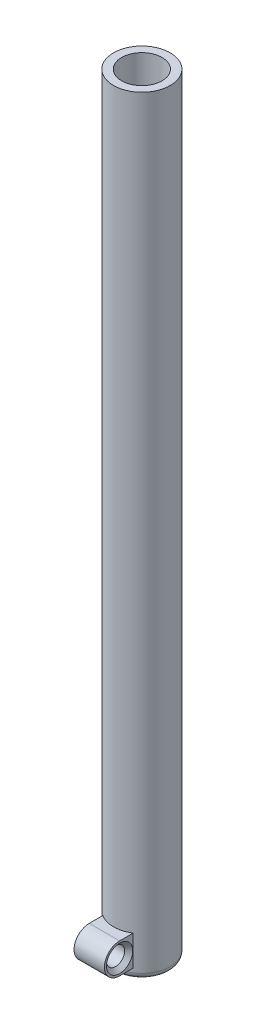
ISO-10303-21;
HEADER;
FILE_DESCRIPTION(('STEP AP214'),'2;1');
FILE_NAME('part.step','',(''),(''),'','','');
FILE_SCHEMA(('AUTOMOTIVE_DESIGN { 1 0 10303 214 1 1 1 1 }'));
ENDSEC;
DATA;
#1=APPLICATION_CONTEXT('core data for automotive mechanical design processes');
#2=APPLICATION_PROTOCOL_DEFINITION('international standard','automotive_design',2000,#1);
#3=PRODUCT_CONTEXT('',#1,'mechanical');
#4=PRODUCT('Part','Part','',(#3));
#5=PRODUCT_RELATED_PRODUCT_CATEGORY('part','',(#4));
#6=PRODUCT_DEFINITION_FORMATION('','',#4);
#7=PRODUCT_DEFINITION_CONTEXT('part definition',#1,'design');
#8=PRODUCT_DEFINITION('design','',#6,#7);
#9=PRODUCT_DEFINITION_SHAPE('','',#8);
#10=(LENGTH_UNIT() NAMED_UNIT(*) SI_UNIT(.MILLI.,.METRE.));
#11=(NAMED_UNIT(*) PLANE_ANGLE_UNIT() SI_UNIT($,.RADIAN.));
#12=(NAMED_UNIT(*) SI_UNIT($,.STERADIAN.) SOLID_ANGLE_UNIT());
#13=UNCERTAINTY_MEASURE_WITH_UNIT(LENGTH_MEASURE(1.E-05),#10,'distance_accuracy_value','');
#14=(GEOMETRIC_REPRESENTATION_CONTEXT(3) GLOBAL_UNCERTAINTY_ASSIGNED_CONTEXT((#13)) GLOBAL_UNIT_ASSIGNED_CONTEXT((#10,
#11,#12)) REPRESENTATION_CONTEXT('',''));
#15=CARTESIAN_POINT('',(0.,0.,0.));
#16=DIRECTION('',(0.,0.,1.));
#17=DIRECTION('',(1.,0.,0.));
#18=AXIS2_PLACEMENT_3D('',#15,#16,#17);
#19=CARTESIAN_POINT('',(-7.5,12.5,18.5));
#20=DIRECTION('',(-1.,0.,0.));
#21=DIRECTION('',(0.,0.,1.));
#22=AXIS2_PLACEMENT_3D('',#19,#20,#21);
#23=CYLINDRICAL_SURFACE('',#22,7.5);
#24=DIRECTION('',(1.,0.,0.));
#25=VECTOR('',#24,1.);
#26=CARTESIAN_POINT('',(-7.5,20.,18.5));
#27=LINE('',#26,#25);
#28=CARTESIAN_POINT('',(-7.5,20.,18.5));
#29=VERTEX_POINT('',#28);
#30=CARTESIAN_POINT('',(7.5,20.,18.5));
#31=VERTEX_POINT('',#30);
#32=EDGE_CURVE('E127',#29,#31,#27,.T.);
#33=ORIENTED_EDGE('',*,*,#32,.F.);
#34=CARTESIAN_POINT('',(-7.5,12.5,18.5));
#35=DIRECTION('',(1.,0.,0.));
#36=DIRECTION('',(0.,1.,0.));
#37=AXIS2_PLACEMENT_3D('',#34,#35,#36);
#38=CIRCLE('',#37,7.5);
#39=CARTESIAN_POINT('',(-7.5,5.,18.5));
#40=VERTEX_POINT('',#39);
#41=EDGE_CURVE('E68',#40,#29,#38,.F.);
#42=ORIENTED_EDGE('',*,*,#41,.F.);
#43=DIRECTION('',(1.,0.,0.));
#44=VECTOR('',#43,1.);
#45=CARTESIAN_POINT('',(-7.5,5.,18.5));
#46=LINE('',#45,#44);
#47=CARTESIAN_POINT('',(7.5,5.,18.5));
#48=VERTEX_POINT('',#47);
#49=EDGE_CURVE('E129',#48,#40,#46,.F.);
#50=ORIENTED_EDGE('',*,*,#49,.F.);
#51=CARTESIAN_POINT('',(7.5,12.5,18.5));
#52=DIRECTION('',(-1.,0.,0.));
#53=DIRECTION('',(0.,-1.,0.));
#54=AXIS2_PLACEMENT_3D('',#51,#52,#53);
#55=CIRCLE('',#54,7.5);
#56=EDGE_CURVE('E61',#31,#48,#55,.F.);
#57=ORIENTED_EDGE('',*,*,#56,.F.);
#58=EDGE_LOOP('',(#33,#42,#50,#57));
#59=FACE_BOUND('',#58,.T.);
#60=ADVANCED_FACE('F46',(#59),#23,.T.);
#61=CARTESIAN_POINT('',(0.,380.,0.));
#62=DIRECTION('',(0.,-1.,0.));
#63=DIRECTION('',(0.,0.,-1.));
#64=AXIS2_PLACEMENT_3D('',#61,#62,#63);
#65=CYLINDRICAL_SURFACE('',#64,14.);
#66=CARTESIAN_POINT('',(0.,3.,0.));
#67=DIRECTION('',(0.,1.,0.));
#68=DIRECTION('',(0.,0.,1.));
#69=AXIS2_PLACEMENT_3D('',#66,#67,#68);
#70=CIRCLE('',#69,14.);
#71=CARTESIAN_POINT('',(0.,3.,14.));
#72=VERTEX_POINT('',#71);
#73=EDGE_CURVE('E54',#72,#72,#70,.T.);
#74=ORIENTED_EDGE('',*,*,#73,.T.);
#75=EDGE_LOOP('',(#74));
#76=FACE_BOUND('',#75,.T.);
#77=CARTESIAN_POINT('',(0.,380.,0.));
#78=DIRECTION('',(0.,1.,0.));
#79=DIRECTION('',(0.,0.,1.));
#80=AXIS2_PLACEMENT_3D('',#77,#78,#79);
#81=CIRCLE('',#80,14.);
#82=CARTESIAN_POINT('',(0.,380.,14.));
#83=VERTEX_POINT('',#82);
#84=EDGE_CURVE('E122',#83,#83,#81,.T.);
#85=ORIENTED_EDGE('',*,*,#84,.F.);
#86=EDGE_LOOP('',(#85));
#87=FACE_BOUND('',#86,.T.);
#88=DIRECTION('',(0.,-1.,0.));
#89=VECTOR('',#88,1.);
#90=CARTESIAN_POINT('',(-7.49999999999996,380.,11.8215904175369));
#91=LINE('',#90,#89);
#92=CARTESIAN_POINT('',(-7.5,20.,11.8215904175369));
#93=VERTEX_POINT('',#92);
#94=CARTESIAN_POINT('',(-7.5,5.,11.8215904175369));
#95=VERTEX_POINT('',#94);
#96=EDGE_CURVE('E91',#93,#95,#91,.T.);
#97=ORIENTED_EDGE('',*,*,#96,.F.);
#98=CARTESIAN_POINT('',(0.,20.,0.));
#99=DIRECTION('',(0.,1.,0.));
#100=DIRECTION('',(0.,0.,1.));
#101=AXIS2_PLACEMENT_3D('',#98,#99,#100);
#102=CIRCLE('',#101,14.);
#103=CARTESIAN_POINT('',(7.5,20.,11.8215904175369));
#104=VERTEX_POINT('',#103);
#105=EDGE_CURVE('E102',#104,#93,#102,.F.);
#106=ORIENTED_EDGE('',*,*,#105,.F.);
#107=DIRECTION('',(0.,-1.,0.));
#108=VECTOR('',#107,1.);
#109=CARTESIAN_POINT('',(7.49999999999998,380.,11.8215904175369));
#110=LINE('',#109,#108);
#111=CARTESIAN_POINT('',(7.49999999999998,4.99999999999995,11.8215904175369));
#112=VERTEX_POINT('',#111);
#113=EDGE_CURVE('E109',#112,#104,#110,.F.);
#114=ORIENTED_EDGE('',*,*,#113,.F.);
#115=CARTESIAN_POINT('',(0.,5.,0.));
#116=DIRECTION('',(0.,-1.,0.));
#117=DIRECTION('',(0.,0.,-1.));
#118=AXIS2_PLACEMENT_3D('',#115,#116,#117);
#119=CIRCLE('',#118,14.);
#120=EDGE_CURVE('E105',#95,#112,#119,.F.);
#121=ORIENTED_EDGE('',*,*,#120,.F.);
#122=EDGE_LOOP('',(#97,#106,#114,#121));
#123=FACE_BOUND('',#122,.T.);
#124=ADVANCED_FACE('F100',(#76,#87,#123),#65,.T.);
#125=CARTESIAN_POINT('',(0.,380.,0.));
#126=DIRECTION('',(0.,1.,0.));
#127=DIRECTION('',(0.,0.,1.));
#128=AXIS2_PLACEMENT_3D('',#125,#126,#127);
#129=PLANE('',#128);
#130=ORIENTED_EDGE('',*,*,#84,.T.);
#131=EDGE_LOOP('',(#130));
#132=FACE_BOUND('',#131,.T.);
#133=CARTESIAN_POINT('',(0.,380.,0.));
#134=DIRECTION('',(0.,1.,0.));
#135=DIRECTION('',(0.,0.,1.));
#136=AXIS2_PLACEMENT_3D('',#133,#134,#135);
#137=CIRCLE('',#136,10.);
#138=CARTESIAN_POINT('',(0.,380.,10.));
#139=VERTEX_POINT('',#138);
#140=EDGE_CURVE('E119',#139,#139,#137,.T.);
#141=ORIENTED_EDGE('',*,*,#140,.F.);
#142=EDGE_LOOP('',(#141));
#143=FACE_BOUND('',#142,.T.);
#144=ADVANCED_FACE('F163',(#132,#143),#129,.T.);
#145=CARTESIAN_POINT('',(0.,0.,0.));
#146=DIRECTION('',(0.,1.,0.));
#147=DIRECTION('',(0.,0.,1.));
#148=AXIS2_PLACEMENT_3D('',#145,#146,#147);
#149=PLANE('',#148);
#150=CARTESIAN_POINT('',(0.,0.,0.));
#151=DIRECTION('',(0.,1.,0.));
#152=DIRECTION('',(0.,0.,1.));
#153=AXIS2_PLACEMENT_3D('',#150,#151,#152);
#154=CIRCLE('',#153,11.);
#155=CARTESIAN_POINT('',(0.,0.,11.));
#156=VERTEX_POINT('',#155);
#157=EDGE_CURVE('E13',#156,#156,#154,.F.);
#158=ORIENTED_EDGE('',*,*,#157,.T.);
#159=EDGE_LOOP('',(#158));
#160=FACE_BOUND('',#159,.T.);
#161=CARTESIAN_POINT('',(0.,0.,0.));
#162=DIRECTION('',(0.,1.,0.));
#163=DIRECTION('',(0.,0.,1.));
#164=AXIS2_PLACEMENT_3D('',#161,#162,#163);
#165=CIRCLE('',#164,10.);
#166=CARTESIAN_POINT('',(0.,0.,10.));
#167=VERTEX_POINT('',#166);
#168=EDGE_CURVE('E118',#167,#167,#165,.T.);
#169=ORIENTED_EDGE('',*,*,#168,.T.);
#170=EDGE_LOOP('',(#169));
#171=FACE_BOUND('',#170,.T.);
#172=ADVANCED_FACE('F193',(#160,#171),#149,.F.);
#173=CARTESIAN_POINT('',(0.,380.,0.));
#174=DIRECTION('',(0.,-1.,0.));
#175=DIRECTION('',(0.,0.,-1.));
#176=AXIS2_PLACEMENT_3D('',#173,#174,#175);
#177=CYLINDRICAL_SURFACE('',#176,10.);
#178=ORIENTED_EDGE('',*,*,#140,.T.);
#179=EDGE_LOOP('',(#178));
#180=FACE_BOUND('',#179,.T.);
#181=ORIENTED_EDGE('',*,*,#168,.F.);
#182=EDGE_LOOP('',(#181));
#183=FACE_BOUND('',#182,.T.);
#184=ADVANCED_FACE('F184',(#180,#183),#177,.F.);
#185=CARTESIAN_POINT('',(-7.5,20.,26.));
#186=DIRECTION('',(1.,0.,0.));
#187=DIRECTION('',(0.,1.,0.));
#188=AXIS2_PLACEMENT_3D('',#185,#186,#187);
#189=PLANE('',#188);
#190=CARTESIAN_POINT('',(-7.5,12.5,18.5));
#191=DIRECTION('',(1.,0.,0.));
#192=DIRECTION('',(0.,1.,0.));
#193=AXIS2_PLACEMENT_3D('',#190,#191,#192);
#194=CIRCLE('',#193,6.5);
#195=CARTESIAN_POINT('',(-7.5,19.,18.5));
#196=VERTEX_POINT('',#195);
#197=EDGE_CURVE('E133',#196,#196,#194,.T.);
#198=ORIENTED_EDGE('',*,*,#197,.T.);
#199=EDGE_LOOP('',(#198));
#200=FACE_BOUND('',#199,.T.);
#201=DIRECTION('',(0.,0.,-1.));
#202=VECTOR('',#201,1.);
#203=CARTESIAN_POINT('',(-7.5,5.,26.));
#204=LINE('',#203,#202);
#205=EDGE_CURVE('E116',#40,#95,#204,.T.);
#206=ORIENTED_EDGE('',*,*,#205,.F.);
#207=ORIENTED_EDGE('',*,*,#41,.T.);
#208=DIRECTION('',(0.,0.,-1.));
#209=VECTOR('',#208,1.);
#210=CARTESIAN_POINT('',(-7.5,20.,26.));
#211=LINE('',#210,#209);
#212=EDGE_CURVE('E87',#29,#93,#211,.T.);
#213=ORIENTED_EDGE('',*,*,#212,.T.);
#214=ORIENTED_EDGE('',*,*,#96,.T.);
#215=EDGE_LOOP('',(#206,#207,#213,#214));
#216=FACE_BOUND('',#215,.T.);
#217=ADVANCED_FACE('F90',(#200,#216),#189,.F.);
#218=CARTESIAN_POINT('',(-7.5,5.,26.));
#219=DIRECTION('',(0.,1.,0.));
#220=DIRECTION('',(0.,0.,1.));
#221=AXIS2_PLACEMENT_3D('',#218,#219,#220);
#222=PLANE('',#221);
#223=DIRECTION('',(0.,0.,-1.));
#224=VECTOR('',#223,1.);
#225=CARTESIAN_POINT('',(7.5,5.,26.));
#226=LINE('',#225,#224);
#227=EDGE_CURVE('E114',#48,#112,#226,.T.);
#228=ORIENTED_EDGE('',*,*,#227,.F.);
#229=ORIENTED_EDGE('',*,*,#49,.T.);
#230=ORIENTED_EDGE('',*,*,#205,.T.);
#231=ORIENTED_EDGE('',*,*,#120,.T.);
#232=EDGE_LOOP('',(#228,#229,#230,#231));
#233=FACE_BOUND('',#232,.T.);
#234=ADVANCED_FACE('F183',(#233),#222,.F.);
#235=CARTESIAN_POINT('',(7.5,20.,26.));
#236=DIRECTION('',(-1.,0.,0.));
#237=DIRECTION('',(0.,-1.,0.));
#238=AXIS2_PLACEMENT_3D('',#235,#236,#237);
#239=PLANE('',#238);
#240=CARTESIAN_POINT('',(7.5,12.5,18.5));
#241=DIRECTION('',(-1.,0.,0.));
#242=DIRECTION('',(0.,-1.,0.));
#243=AXIS2_PLACEMENT_3D('',#240,#241,#242);
#244=CIRCLE('',#243,6.49999999999989);
#245=CARTESIAN_POINT('',(7.5,6.00000000000011,18.5));
#246=VERTEX_POINT('',#245);
#247=EDGE_CURVE('E142',#246,#246,#244,.T.);
#248=ORIENTED_EDGE('',*,*,#247,.T.);
#249=EDGE_LOOP('',(#248));
#250=FACE_BOUND('',#249,.T.);
#251=DIRECTION('',(0.,0.,-1.));
#252=VECTOR('',#251,1.);
#253=CARTESIAN_POINT('',(7.5,20.,26.));
#254=LINE('',#253,#252);
#255=EDGE_CURVE('E95',#31,#104,#254,.T.);
#256=ORIENTED_EDGE('',*,*,#255,.F.);
#257=ORIENTED_EDGE('',*,*,#56,.T.);
#258=ORIENTED_EDGE('',*,*,#227,.T.);
#259=ORIENTED_EDGE('',*,*,#113,.T.);
#260=EDGE_LOOP('',(#256,#257,#258,#259));
#261=FACE_BOUND('',#260,.T.);
#262=ADVANCED_FACE('F190',(#250,#261),#239,.F.);
#263=CARTESIAN_POINT('',(-7.5,20.,26.));
#264=DIRECTION('',(0.,-1.,0.));
#265=DIRECTION('',(0.,0.,-1.));
#266=AXIS2_PLACEMENT_3D('',#263,#264,#265);
#267=PLANE('',#266);
#268=ORIENTED_EDGE('',*,*,#212,.F.);
#269=ORIENTED_EDGE('',*,*,#32,.T.);
#270=ORIENTED_EDGE('',*,*,#255,.T.);
#271=ORIENTED_EDGE('',*,*,#105,.T.);
#272=EDGE_LOOP('',(#268,#269,#270,#271));
#273=FACE_BOUND('',#272,.T.);
#274=ADVANCED_FACE('F107',(#273),#267,.F.);
#275=CARTESIAN_POINT('',(-14.,12.5,18.5));
#276=DIRECTION('',(1.,0.,0.));
#277=DIRECTION('',(0.,1.,0.));
#278=AXIS2_PLACEMENT_3D('',#275,#276,#277);
#279=CYLINDRICAL_SURFACE('',#278,4.5);
#280=CARTESIAN_POINT('',(-5.50000000000001,12.5,18.5));
#281=DIRECTION('',(1.,0.,0.));
#282=DIRECTION('',(0.,1.,0.));
#283=AXIS2_PLACEMENT_3D('',#280,#281,#282);
#284=CIRCLE('',#283,4.5);
#285=CARTESIAN_POINT('',(-5.50000000000002,17.,18.5));
#286=VERTEX_POINT('',#285);
#287=EDGE_CURVE('E139',#286,#286,#284,.F.);
#288=ORIENTED_EDGE('',*,*,#287,.T.);
#289=EDGE_LOOP('',(#288));
#290=FACE_BOUND('',#289,.T.);
#291=CARTESIAN_POINT('',(5.50000000000009,12.5,18.5));
#292=DIRECTION('',(-1.,0.,0.));
#293=DIRECTION('',(0.,0.,1.));
#294=AXIS2_PLACEMENT_3D('',#291,#292,#293);
#295=CIRCLE('',#294,4.5);
#296=CARTESIAN_POINT('',(5.50000000000009,12.5,23.));
#297=VERTEX_POINT('',#296);
#298=EDGE_CURVE('E136',#297,#297,#295,.F.);
#299=ORIENTED_EDGE('',*,*,#298,.T.);
#300=EDGE_LOOP('',(#299));
#301=FACE_BOUND('',#300,.T.);
#302=ADVANCED_FACE('F171',(#290,#301),#279,.F.);
#303=CARTESIAN_POINT('',(-7.5,12.5,18.5));
#304=DIRECTION('',(-1.,0.,0.));
#305=DIRECTION('',(0.,-1.,0.));
#306=AXIS2_PLACEMENT_3D('',#303,#304,#305);
#307=CONICAL_SURFACE('',#306,6.50000000000001,0.785398163397452);
#308=ORIENTED_EDGE('',*,*,#287,.F.);
#309=EDGE_LOOP('',(#308));
#310=FACE_BOUND('',#309,.T.);
#311=ORIENTED_EDGE('',*,*,#197,.F.);
#312=EDGE_LOOP('',(#311));
#313=FACE_BOUND('',#312,.T.);
#314=ADVANCED_FACE('F155',(#310,#313),#307,.F.);
#315=CARTESIAN_POINT('',(5.50000000000009,12.5,18.5));
#316=DIRECTION('',(1.,0.,0.));
#317=DIRECTION('',(0.,0.,-1.));
#318=AXIS2_PLACEMENT_3D('',#315,#316,#317);
#319=CONICAL_SURFACE('',#318,4.5,0.785398163397444);
#320=ORIENTED_EDGE('',*,*,#247,.F.);
#321=EDGE_LOOP('',(#320));
#322=FACE_BOUND('',#321,.T.);
#323=ORIENTED_EDGE('',*,*,#298,.F.);
#324=EDGE_LOOP('',(#323));
#325=FACE_BOUND('',#324,.T.);
#326=ADVANCED_FACE('F150',(#322,#325),#319,.F.);
#327=CARTESIAN_POINT('',(0.,3.,0.));
#328=DIRECTION('',(0.,1.,0.));
#329=DIRECTION('',(0.,0.,1.));
#330=AXIS2_PLACEMENT_3D('',#327,#328,#329);
#331=TOROIDAL_SURFACE('',#330,11.,3.);
#332=ORIENTED_EDGE('',*,*,#157,.F.);
#333=EDGE_LOOP('',(#332));
#334=FACE_BOUND('',#333,.T.);
#335=ORIENTED_EDGE('',*,*,#73,.F.);
#336=EDGE_LOOP('',(#335));
#337=FACE_BOUND('',#336,.T.);
#338=ADVANCED_FACE('F48',(#334,#337),#331,.T.);
#339=CLOSED_SHELL('',(#60,#124,#144,#172,#184,#217,#234,#262,#274,#302,#314,#326,#338));
#340=MANIFOLD_SOLID_BREP('B2',#339);
#341=ADVANCED_BREP_SHAPE_REPRESENTATION('',(#18,#340),#14);
#342=SHAPE_DEFINITION_REPRESENTATION(#9,#341);
ENDSEC;
END-ISO-10303-21;
